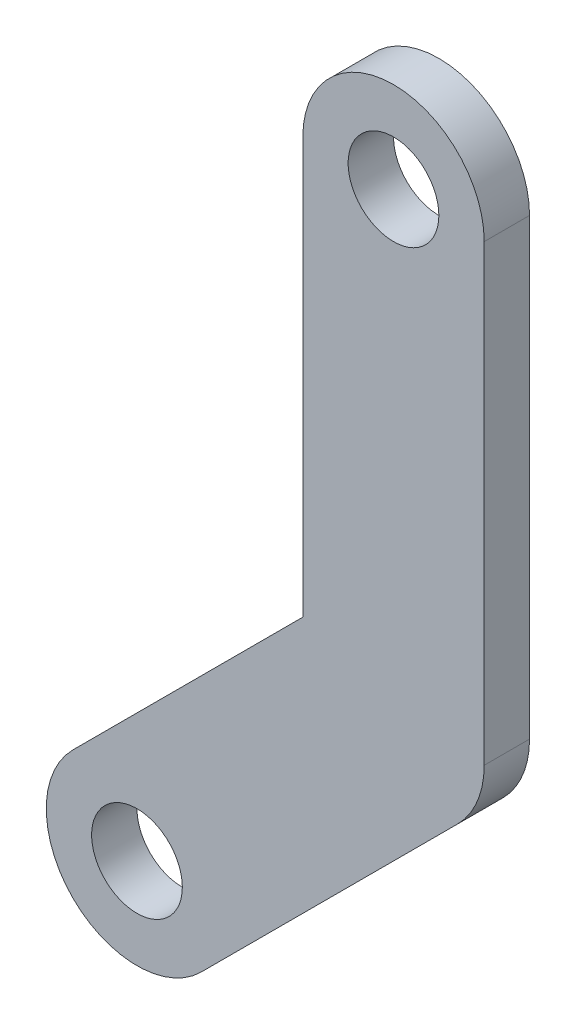
ISO-10303-21;
HEADER;
FILE_DESCRIPTION(('STEP AP214'),'2;1');
FILE_NAME('part.step','',(''),(''),'','','');
FILE_SCHEMA(('AUTOMOTIVE_DESIGN { 1 0 10303 214 1 1 1 1 }'));
ENDSEC;
DATA;
#1=APPLICATION_CONTEXT('core data for automotive mechanical design processes');
#2=APPLICATION_PROTOCOL_DEFINITION('international standard','automotive_design',2000,#1);
#3=PRODUCT_CONTEXT('',#1,'mechanical');
#4=PRODUCT('Part','Part','',(#3));
#5=PRODUCT_RELATED_PRODUCT_CATEGORY('part','',(#4));
#6=PRODUCT_DEFINITION_FORMATION('','',#4);
#7=PRODUCT_DEFINITION_CONTEXT('part definition',#1,'design');
#8=PRODUCT_DEFINITION('design','',#6,#7);
#9=PRODUCT_DEFINITION_SHAPE('','',#8);
#10=(LENGTH_UNIT() NAMED_UNIT(*) SI_UNIT(.MILLI.,.METRE.));
#11=(NAMED_UNIT(*) PLANE_ANGLE_UNIT() SI_UNIT($,.RADIAN.));
#12=(NAMED_UNIT(*) SI_UNIT($,.STERADIAN.) SOLID_ANGLE_UNIT());
#13=UNCERTAINTY_MEASURE_WITH_UNIT(LENGTH_MEASURE(1.E-05),#10,'distance_accuracy_value','');
#14=(GEOMETRIC_REPRESENTATION_CONTEXT(3) GLOBAL_UNCERTAINTY_ASSIGNED_CONTEXT((#13)) GLOBAL_UNIT_ASSIGNED_CONTEXT((#10,
#11,#12)) REPRESENTATION_CONTEXT('',''));
#15=CARTESIAN_POINT('',(0.,0.,0.));
#16=DIRECTION('',(0.,0.,1.));
#17=DIRECTION('',(1.,0.,0.));
#18=AXIS2_PLACEMENT_3D('',#15,#16,#17);
#19=CARTESIAN_POINT('',(36.5685424949239,0.,10.));
#20=DIRECTION('',(-1.,0.,0.));
#21=DIRECTION('',(0.,-1.,0.));
#22=AXIS2_PLACEMENT_3D('',#19,#20,#21);
#23=PLANE('',#22);
#24=DIRECTION('',(0.,1.,0.));
#25=VECTOR('',#24,1.);
#26=CARTESIAN_POINT('',(36.5685424949239,0.,0.));
#27=LINE('',#26,#25);
#28=CARTESIAN_POINT('',(36.5685424949239,64.8528137423856,0.));
#29=VERTEX_POINT('',#28);
#30=CARTESIAN_POINT('',(36.5685424949239,156.568542494924,0.));
#31=VERTEX_POINT('',#30);
#32=EDGE_CURVE('E134',#29,#31,#27,.T.);
#33=ORIENTED_EDGE('',*,*,#32,.F.);
#34=DIRECTION('',(0.,0.,-1.));
#35=VECTOR('',#34,1.);
#36=CARTESIAN_POINT('',(36.5685424949239,64.8528137423856,10.));
#37=LINE('',#36,#35);
#38=CARTESIAN_POINT('',(36.5685424949239,64.8528137423856,10.));
#39=VERTEX_POINT('',#38);
#40=EDGE_CURVE('E11',#39,#29,#37,.T.);
#41=ORIENTED_EDGE('',*,*,#40,.F.);
#42=DIRECTION('',(0.,1.,0.));
#43=VECTOR('',#42,1.);
#44=CARTESIAN_POINT('',(36.5685424949239,0.,10.));
#45=LINE('',#44,#43);
#46=CARTESIAN_POINT('',(36.5685424949239,156.568542494924,10.));
#47=VERTEX_POINT('',#46);
#48=EDGE_CURVE('E154',#39,#47,#45,.T.);
#49=ORIENTED_EDGE('',*,*,#48,.T.);
#50=DIRECTION('',(0.,0.,-1.));
#51=VECTOR('',#50,1.);
#52=CARTESIAN_POINT('',(36.5685424949239,156.568542494924,10.));
#53=LINE('',#52,#51);
#54=EDGE_CURVE('E89',#47,#31,#53,.T.);
#55=ORIENTED_EDGE('',*,*,#54,.T.);
#56=EDGE_LOOP('',(#33,#41,#49,#55));
#57=FACE_BOUND('',#56,.T.);
#58=ADVANCED_FACE('F41',(#57),#23,.T.);
#59=CARTESIAN_POINT('',(-14.1421356237309,14.142135623731,10.));
#60=DIRECTION('',(-0.707106781186546,0.707106781186549,0.));
#61=DIRECTION('',(-0.707106781186549,-0.707106781186546,0.));
#62=AXIS2_PLACEMENT_3D('',#59,#60,#61);
#63=PLANE('',#62);
#64=DIRECTION('',(0.707106781186549,0.707106781186546,0.));
#65=VECTOR('',#64,1.);
#66=CARTESIAN_POINT('',(-14.1421356237309,14.142135623731,0.));
#67=LINE('',#66,#65);
#68=CARTESIAN_POINT('',(-14.1421356237309,14.142135623731,0.));
#69=VERTEX_POINT('',#68);
#70=EDGE_CURVE('E137',#69,#29,#67,.T.);
#71=ORIENTED_EDGE('',*,*,#70,.F.);
#72=DIRECTION('',(0.,0.,-1.));
#73=VECTOR('',#72,1.);
#74=CARTESIAN_POINT('',(-14.1421356237309,14.142135623731,10.));
#75=LINE('',#74,#73);
#76=CARTESIAN_POINT('',(-14.1421356237309,14.142135623731,10.));
#77=VERTEX_POINT('',#76);
#78=EDGE_CURVE('E49',#77,#69,#75,.T.);
#79=ORIENTED_EDGE('',*,*,#78,.F.);
#80=DIRECTION('',(0.707106781186549,0.707106781186546,0.));
#81=VECTOR('',#80,1.);
#82=CARTESIAN_POINT('',(-14.1421356237309,14.142135623731,10.));
#83=LINE('',#82,#81);
#84=EDGE_CURVE('E175',#77,#39,#83,.T.);
#85=ORIENTED_EDGE('',*,*,#84,.T.);
#86=ORIENTED_EDGE('',*,*,#40,.T.);
#87=EDGE_LOOP('',(#71,#79,#85,#86));
#88=FACE_BOUND('',#87,.T.);
#89=ADVANCED_FACE('F174',(#88),#63,.T.);
#90=CARTESIAN_POINT('',(0.,0.,10.));
#91=DIRECTION('',(0.,0.,-1.));
#92=DIRECTION('',(-1.,0.,0.));
#93=AXIS2_PLACEMENT_3D('',#90,#91,#92);
#94=CYLINDRICAL_SURFACE('',#93,20.);
#95=CARTESIAN_POINT('',(0.,0.,0.));
#96=DIRECTION('',(0.,0.,1.));
#97=DIRECTION('',(1.,0.,0.));
#98=AXIS2_PLACEMENT_3D('',#95,#96,#97);
#99=CIRCLE('',#98,20.);
#100=CARTESIAN_POINT('',(14.1421356237309,-14.142135623731,0.));
#101=VERTEX_POINT('',#100);
#102=EDGE_CURVE('E140',#69,#101,#99,.T.);
#103=ORIENTED_EDGE('',*,*,#102,.T.);
#104=DIRECTION('',(0.,0.,-1.));
#105=VECTOR('',#104,1.);
#106=CARTESIAN_POINT('',(14.1421356237309,-14.142135623731,10.));
#107=LINE('',#106,#105);
#108=CARTESIAN_POINT('',(14.1421356237309,-14.142135623731,10.));
#109=VERTEX_POINT('',#108);
#110=EDGE_CURVE('E158',#109,#101,#107,.T.);
#111=ORIENTED_EDGE('',*,*,#110,.F.);
#112=CARTESIAN_POINT('',(0.,0.,10.));
#113=DIRECTION('',(0.,0.,1.));
#114=DIRECTION('',(1.,0.,0.));
#115=AXIS2_PLACEMENT_3D('',#112,#113,#114);
#116=CIRCLE('',#115,20.);
#117=EDGE_CURVE('E165',#77,#109,#116,.T.);
#118=ORIENTED_EDGE('',*,*,#117,.F.);
#119=ORIENTED_EDGE('',*,*,#78,.T.);
#120=EDGE_LOOP('',(#103,#111,#118,#119));
#121=FACE_BOUND('',#120,.T.);
#122=ADVANCED_FACE('F163',(#121),#94,.T.);
#123=CARTESIAN_POINT('',(14.1421356237309,-14.142135623731,10.));
#124=DIRECTION('',(-0.707106781186546,0.707106781186549,0.));
#125=DIRECTION('',(-0.707106781186549,-0.707106781186546,0.));
#126=AXIS2_PLACEMENT_3D('',#123,#124,#125);
#127=PLANE('',#126);
#128=DIRECTION('',(0.707106781186549,0.707106781186546,0.));
#129=VECTOR('',#128,1.);
#130=CARTESIAN_POINT('',(14.1421356237309,-14.142135623731,0.));
#131=LINE('',#130,#129);
#132=CARTESIAN_POINT('',(70.7106781186548,42.4264068711927,0.));
#133=VERTEX_POINT('',#132);
#134=EDGE_CURVE('E142',#101,#133,#131,.T.);
#135=ORIENTED_EDGE('',*,*,#134,.T.);
#136=DIRECTION('',(0.,0.,-1.));
#137=VECTOR('',#136,1.);
#138=CARTESIAN_POINT('',(70.7106781186548,42.4264068711927,10.));
#139=LINE('',#138,#137);
#140=CARTESIAN_POINT('',(70.7106781186548,42.4264068711927,10.));
#141=VERTEX_POINT('',#140);
#142=EDGE_CURVE('E120',#141,#133,#139,.T.);
#143=ORIENTED_EDGE('',*,*,#142,.F.);
#144=DIRECTION('',(0.707106781186549,0.707106781186546,0.));
#145=VECTOR('',#144,1.);
#146=CARTESIAN_POINT('',(14.1421356237309,-14.142135623731,10.));
#147=LINE('',#146,#145);
#148=EDGE_CURVE('E111',#109,#141,#147,.T.);
#149=ORIENTED_EDGE('',*,*,#148,.F.);
#150=ORIENTED_EDGE('',*,*,#110,.T.);
#151=EDGE_LOOP('',(#135,#143,#149,#150));
#152=FACE_BOUND('',#151,.T.);
#153=ADVANCED_FACE('F183',(#152),#127,.F.);
#154=CARTESIAN_POINT('',(56.5685424949239,56.5685424949237,10.));
#155=DIRECTION('',(0.,0.,-1.));
#156=DIRECTION('',(-1.,0.,0.));
#157=AXIS2_PLACEMENT_3D('',#154,#155,#156);
#158=CYLINDRICAL_SURFACE('',#157,20.);
#159=CARTESIAN_POINT('',(56.5685424949239,56.5685424949237,0.));
#160=DIRECTION('',(0.,0.,1.));
#161=DIRECTION('',(1.,0.,0.));
#162=AXIS2_PLACEMENT_3D('',#159,#160,#161);
#163=CIRCLE('',#162,20.);
#164=CARTESIAN_POINT('',(76.5685424949239,56.5685424949237,0.));
#165=VERTEX_POINT('',#164);
#166=EDGE_CURVE('E119',#133,#165,#163,.T.);
#167=ORIENTED_EDGE('',*,*,#166,.T.);
#168=DIRECTION('',(0.,0.,-1.));
#169=VECTOR('',#168,1.);
#170=CARTESIAN_POINT('',(76.5685424949239,56.5685424949237,10.));
#171=LINE('',#170,#169);
#172=CARTESIAN_POINT('',(76.5685424949239,56.5685424949237,10.));
#173=VERTEX_POINT('',#172);
#174=EDGE_CURVE('E116',#173,#165,#171,.T.);
#175=ORIENTED_EDGE('',*,*,#174,.F.);
#176=CARTESIAN_POINT('',(56.5685424949239,56.5685424949237,10.));
#177=DIRECTION('',(0.,0.,1.));
#178=DIRECTION('',(1.,0.,0.));
#179=AXIS2_PLACEMENT_3D('',#176,#177,#178);
#180=CIRCLE('',#179,20.);
#181=EDGE_CURVE('E104',#141,#173,#180,.T.);
#182=ORIENTED_EDGE('',*,*,#181,.F.);
#183=ORIENTED_EDGE('',*,*,#142,.T.);
#184=EDGE_LOOP('',(#167,#175,#182,#183));
#185=FACE_BOUND('',#184,.T.);
#186=ADVANCED_FACE('F117',(#185),#158,.T.);
#187=CARTESIAN_POINT('',(76.5685424949239,0.,10.));
#188=DIRECTION('',(-1.,0.,0.));
#189=DIRECTION('',(0.,-1.,0.));
#190=AXIS2_PLACEMENT_3D('',#187,#188,#189);
#191=PLANE('',#190);
#192=DIRECTION('',(0.,1.,0.));
#193=VECTOR('',#192,1.);
#194=CARTESIAN_POINT('',(76.5685424949239,0.,0.));
#195=LINE('',#194,#193);
#196=CARTESIAN_POINT('',(76.5685424949239,156.568542494924,0.));
#197=VERTEX_POINT('',#196);
#198=EDGE_CURVE('E82',#165,#197,#195,.T.);
#199=ORIENTED_EDGE('',*,*,#198,.T.);
#200=DIRECTION('',(0.,0.,-1.));
#201=VECTOR('',#200,1.);
#202=CARTESIAN_POINT('',(76.5685424949239,156.568542494924,10.));
#203=LINE('',#202,#201);
#204=CARTESIAN_POINT('',(76.5685424949239,156.568542494924,10.));
#205=VERTEX_POINT('',#204);
#206=EDGE_CURVE('E121',#205,#197,#203,.T.);
#207=ORIENTED_EDGE('',*,*,#206,.F.);
#208=DIRECTION('',(0.,1.,0.));
#209=VECTOR('',#208,1.);
#210=CARTESIAN_POINT('',(76.5685424949239,0.,10.));
#211=LINE('',#210,#209);
#212=EDGE_CURVE('E109',#173,#205,#211,.T.);
#213=ORIENTED_EDGE('',*,*,#212,.F.);
#214=ORIENTED_EDGE('',*,*,#174,.T.);
#215=EDGE_LOOP('',(#199,#207,#213,#214));
#216=FACE_BOUND('',#215,.T.);
#217=ADVANCED_FACE('F123',(#216),#191,.F.);
#218=CARTESIAN_POINT('',(56.5685424949239,156.568542494924,10.));
#219=DIRECTION('',(0.,0.,-1.));
#220=DIRECTION('',(-1.,0.,0.));
#221=AXIS2_PLACEMENT_3D('',#218,#219,#220);
#222=CYLINDRICAL_SURFACE('',#221,10.);
#223=CARTESIAN_POINT('',(56.5685424949239,156.568542494924,10.));
#224=DIRECTION('',(0.,0.,1.));
#225=DIRECTION('',(1.,0.,0.));
#226=AXIS2_PLACEMENT_3D('',#223,#224,#225);
#227=CIRCLE('',#226,10.);
#228=CARTESIAN_POINT('',(66.5685424949239,156.568542494924,10.));
#229=VERTEX_POINT('',#228);
#230=EDGE_CURVE('E125',#229,#229,#227,.T.);
#231=ORIENTED_EDGE('',*,*,#230,.T.);
#232=EDGE_LOOP('',(#231));
#233=FACE_BOUND('',#232,.T.);
#234=CARTESIAN_POINT('',(56.5685424949239,156.568542494924,0.));
#235=DIRECTION('',(0.,0.,1.));
#236=DIRECTION('',(1.,0.,0.));
#237=AXIS2_PLACEMENT_3D('',#234,#235,#236);
#238=CIRCLE('',#237,10.);
#239=CARTESIAN_POINT('',(66.5685424949239,156.568542494924,0.));
#240=VERTEX_POINT('',#239);
#241=EDGE_CURVE('E148',#240,#240,#238,.T.);
#242=ORIENTED_EDGE('',*,*,#241,.F.);
#243=EDGE_LOOP('',(#242));
#244=FACE_BOUND('',#243,.T.);
#245=ADVANCED_FACE('F224',(#233,#244),#222,.F.);
#246=CARTESIAN_POINT('',(56.5685424949239,156.568542494924,10.));
#247=DIRECTION('',(0.,0.,-1.));
#248=DIRECTION('',(-1.,0.,0.));
#249=AXIS2_PLACEMENT_3D('',#246,#247,#248);
#250=CYLINDRICAL_SURFACE('',#249,20.);
#251=CARTESIAN_POINT('',(56.5685424949239,156.568542494924,0.));
#252=DIRECTION('',(0.,0.,1.));
#253=DIRECTION('',(1.,0.,0.));
#254=AXIS2_PLACEMENT_3D('',#251,#252,#253);
#255=CIRCLE('',#254,20.);
#256=EDGE_CURVE('E146',#197,#31,#255,.T.);
#257=ORIENTED_EDGE('',*,*,#256,.T.);
#258=ORIENTED_EDGE('',*,*,#54,.F.);
#259=CARTESIAN_POINT('',(56.5685424949239,156.568542494924,10.));
#260=DIRECTION('',(0.,0.,1.));
#261=DIRECTION('',(1.,0.,0.));
#262=AXIS2_PLACEMENT_3D('',#259,#260,#261);
#263=CIRCLE('',#262,20.);
#264=EDGE_CURVE('E57',#205,#47,#263,.T.);
#265=ORIENTED_EDGE('',*,*,#264,.F.);
#266=ORIENTED_EDGE('',*,*,#206,.T.);
#267=EDGE_LOOP('',(#257,#258,#265,#266));
#268=FACE_BOUND('',#267,.T.);
#269=ADVANCED_FACE('F178',(#268),#250,.T.);
#270=CARTESIAN_POINT('',(0.,0.,10.));
#271=DIRECTION('',(0.,0.,-1.));
#272=DIRECTION('',(-1.,0.,0.));
#273=AXIS2_PLACEMENT_3D('',#270,#271,#272);
#274=CYLINDRICAL_SURFACE('',#273,10.);
#275=CARTESIAN_POINT('',(0.,0.,10.));
#276=DIRECTION('',(0.,0.,1.));
#277=DIRECTION('',(1.,0.,0.));
#278=AXIS2_PLACEMENT_3D('',#275,#276,#277);
#279=CIRCLE('',#278,10.);
#280=CARTESIAN_POINT('',(10.,0.,10.));
#281=VERTEX_POINT('',#280);
#282=EDGE_CURVE('E131',#281,#281,#279,.T.);
#283=ORIENTED_EDGE('',*,*,#282,.T.);
#284=EDGE_LOOP('',(#283));
#285=FACE_BOUND('',#284,.T.);
#286=CARTESIAN_POINT('',(0.,0.,0.));
#287=DIRECTION('',(0.,0.,1.));
#288=DIRECTION('',(1.,0.,0.));
#289=AXIS2_PLACEMENT_3D('',#286,#287,#288);
#290=CIRCLE('',#289,10.);
#291=CARTESIAN_POINT('',(10.,0.,0.));
#292=VERTEX_POINT('',#291);
#293=EDGE_CURVE('E151',#292,#292,#290,.T.);
#294=ORIENTED_EDGE('',*,*,#293,.F.);
#295=EDGE_LOOP('',(#294));
#296=FACE_BOUND('',#295,.T.);
#297=ADVANCED_FACE('F244',(#285,#296),#274,.F.);
#298=CARTESIAN_POINT('',(0.,0.,10.));
#299=DIRECTION('',(0.,0.,1.));
#300=DIRECTION('',(1.,0.,0.));
#301=AXIS2_PLACEMENT_3D('',#298,#299,#300);
#302=PLANE('',#301);
#303=ORIENTED_EDGE('',*,*,#48,.F.);
#304=ORIENTED_EDGE('',*,*,#84,.F.);
#305=ORIENTED_EDGE('',*,*,#117,.T.);
#306=ORIENTED_EDGE('',*,*,#148,.T.);
#307=ORIENTED_EDGE('',*,*,#181,.T.);
#308=ORIENTED_EDGE('',*,*,#212,.T.);
#309=ORIENTED_EDGE('',*,*,#264,.T.);
#310=EDGE_LOOP('',(#303,#304,#305,#306,#307,#308,#309));
#311=FACE_BOUND('',#310,.T.);
#312=ORIENTED_EDGE('',*,*,#230,.F.);
#313=EDGE_LOOP('',(#312));
#314=FACE_BOUND('',#313,.T.);
#315=ORIENTED_EDGE('',*,*,#282,.F.);
#316=EDGE_LOOP('',(#315));
#317=FACE_BOUND('',#316,.T.);
#318=ADVANCED_FACE('F106',(#311,#314,#317),#302,.T.);
#319=CARTESIAN_POINT('',(0.,0.,0.));
#320=DIRECTION('',(0.,0.,1.));
#321=DIRECTION('',(1.,0.,0.));
#322=AXIS2_PLACEMENT_3D('',#319,#320,#321);
#323=PLANE('',#322);
#324=ORIENTED_EDGE('',*,*,#32,.T.);
#325=ORIENTED_EDGE('',*,*,#256,.F.);
#326=ORIENTED_EDGE('',*,*,#198,.F.);
#327=ORIENTED_EDGE('',*,*,#166,.F.);
#328=ORIENTED_EDGE('',*,*,#134,.F.);
#329=ORIENTED_EDGE('',*,*,#102,.F.);
#330=ORIENTED_EDGE('',*,*,#70,.T.);
#331=EDGE_LOOP('',(#324,#325,#326,#327,#328,#329,#330));
#332=FACE_BOUND('',#331,.T.);
#333=ORIENTED_EDGE('',*,*,#241,.T.);
#334=EDGE_LOOP('',(#333));
#335=FACE_BOUND('',#334,.T.);
#336=ORIENTED_EDGE('',*,*,#293,.T.);
#337=EDGE_LOOP('',(#336));
#338=FACE_BOUND('',#337,.T.);
#339=ADVANCED_FACE('F172',(#332,#335,#338),#323,.F.);
#340=CLOSED_SHELL('',(#58,#89,#122,#153,#186,#217,#245,#269,#297,#318,#339));
#341=MANIFOLD_SOLID_BREP('B2',#340);
#342=ADVANCED_BREP_SHAPE_REPRESENTATION('',(#18,#341),#14);
#343=SHAPE_DEFINITION_REPRESENTATION(#9,#342);
ENDSEC;
END-ISO-10303-21;
